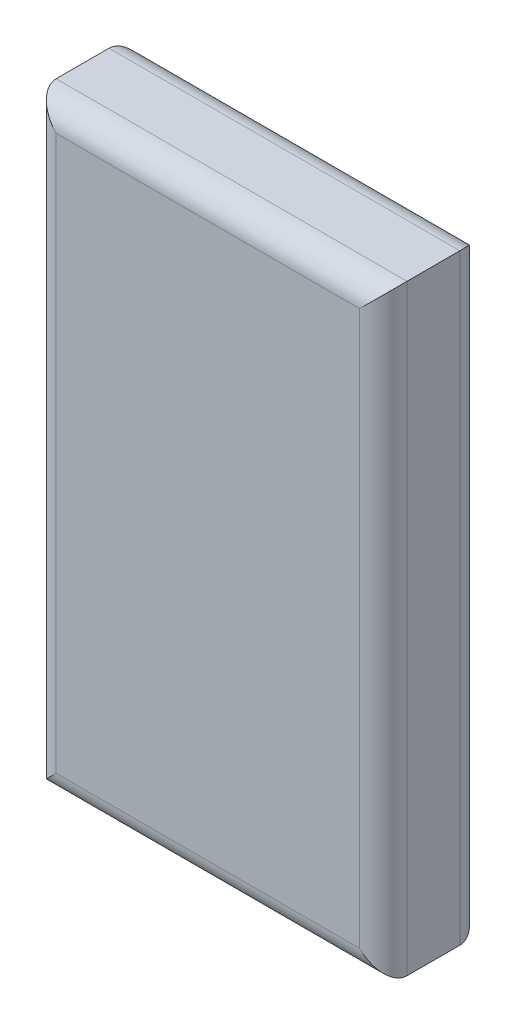
ISO-10303-21;
HEADER;
FILE_DESCRIPTION(('STEP AP214'),'2;1');
FILE_NAME('part.step','',(''),(''),'','','');
FILE_SCHEMA(('AUTOMOTIVE_DESIGN { 1 0 10303 214 1 1 1 1 }'));
ENDSEC;
DATA;
#1=APPLICATION_CONTEXT('core data for automotive mechanical design processes');
#2=APPLICATION_PROTOCOL_DEFINITION('international standard','automotive_design',2000,#1);
#3=PRODUCT_CONTEXT('',#1,'mechanical');
#4=PRODUCT('Part','Part','',(#3));
#5=PRODUCT_RELATED_PRODUCT_CATEGORY('part','',(#4));
#6=PRODUCT_DEFINITION_FORMATION('','',#4);
#7=PRODUCT_DEFINITION_CONTEXT('part definition',#1,'design');
#8=PRODUCT_DEFINITION('design','',#6,#7);
#9=PRODUCT_DEFINITION_SHAPE('','',#8);
#10=(LENGTH_UNIT() NAMED_UNIT(*) SI_UNIT(.MILLI.,.METRE.));
#11=(NAMED_UNIT(*) PLANE_ANGLE_UNIT() SI_UNIT($,.RADIAN.));
#12=(NAMED_UNIT(*) SI_UNIT($,.STERADIAN.) SOLID_ANGLE_UNIT());
#13=UNCERTAINTY_MEASURE_WITH_UNIT(LENGTH_MEASURE(1.E-05),#10,'distance_accuracy_value','');
#14=(GEOMETRIC_REPRESENTATION_CONTEXT(3) GLOBAL_UNCERTAINTY_ASSIGNED_CONTEXT((#13)) GLOBAL_UNIT_ASSIGNED_CONTEXT((#10,
#11,#12)) REPRESENTATION_CONTEXT('',''));
#15=CARTESIAN_POINT('',(0.,0.,0.));
#16=DIRECTION('',(0.,0.,1.));
#17=DIRECTION('',(1.,0.,0.));
#18=AXIS2_PLACEMENT_3D('',#15,#16,#17);
#19=CARTESIAN_POINT('',(11.1125,-19.05,6.35));
#20=DIRECTION('',(-1.,0.,0.));
#21=DIRECTION('',(0.,0.,1.));
#22=AXIS2_PLACEMENT_3D('',#19,#20,#21);
#23=PLANE('',#22);
#24=DIRECTION('',(0.,0.,-1.));
#25=VECTOR('',#24,1.);
#26=CARTESIAN_POINT('',(11.1125,-19.05,6.35));
#27=LINE('',#26,#25);
#28=CARTESIAN_POINT('',(11.1125,-19.05,4.85));
#29=VERTEX_POINT('',#28);
#30=CARTESIAN_POINT('',(11.1125,-19.05,1.5));
#31=VERTEX_POINT('',#30);
#32=EDGE_CURVE('E142',#29,#31,#27,.T.);
#33=ORIENTED_EDGE('',*,*,#32,.T.);
#34=DIRECTION('',(0.,1.,0.));
#35=VECTOR('',#34,1.);
#36=CARTESIAN_POINT('',(11.1125,19.05,1.5));
#37=LINE('',#36,#35);
#38=CARTESIAN_POINT('',(11.1125,19.05,1.5));
#39=VERTEX_POINT('',#38);
#40=EDGE_CURVE('E151',#31,#39,#37,.T.);
#41=ORIENTED_EDGE('',*,*,#40,.T.);
#42=DIRECTION('',(0.,0.,-1.));
#43=VECTOR('',#42,1.);
#44=CARTESIAN_POINT('',(11.1125,19.05,6.35));
#45=LINE('',#44,#43);
#46=CARTESIAN_POINT('',(11.1125,19.05,4.85));
#47=VERTEX_POINT('',#46);
#48=EDGE_CURVE('E120',#47,#39,#45,.T.);
#49=ORIENTED_EDGE('',*,*,#48,.F.);
#50=DIRECTION('',(0.,1.,0.));
#51=VECTOR('',#50,1.);
#52=CARTESIAN_POINT('',(11.1125,-19.05,4.85));
#53=LINE('',#52,#51);
#54=EDGE_CURVE('E153',#47,#29,#53,.F.);
#55=ORIENTED_EDGE('',*,*,#54,.T.);
#56=EDGE_LOOP('',(#33,#41,#49,#55));
#57=FACE_BOUND('',#56,.T.);
#58=ADVANCED_FACE('F33',(#57),#23,.F.);
#59=CARTESIAN_POINT('',(-11.1125,19.05,6.35));
#60=DIRECTION('',(0.,-1.,0.));
#61=DIRECTION('',(0.,0.,-1.));
#62=AXIS2_PLACEMENT_3D('',#59,#60,#61);
#63=PLANE('',#62);
#64=ORIENTED_EDGE('',*,*,#48,.T.);
#65=DIRECTION('',(-1.,0.,0.));
#66=VECTOR('',#65,1.);
#67=CARTESIAN_POINT('',(-11.1125,19.05,1.5));
#68=LINE('',#67,#66);
#69=CARTESIAN_POINT('',(-11.1125,19.05,1.5));
#70=VERTEX_POINT('',#69);
#71=EDGE_CURVE('E119',#39,#70,#68,.T.);
#72=ORIENTED_EDGE('',*,*,#71,.T.);
#73=DIRECTION('',(0.,0.,-1.));
#74=VECTOR('',#73,1.);
#75=CARTESIAN_POINT('',(-11.1125,19.05,6.35));
#76=LINE('',#75,#74);
#77=CARTESIAN_POINT('',(-11.1125,19.05,4.85));
#78=VERTEX_POINT('',#77);
#79=EDGE_CURVE('E102',#78,#70,#76,.T.);
#80=ORIENTED_EDGE('',*,*,#79,.F.);
#81=DIRECTION('',(-1.,0.,0.));
#82=VECTOR('',#81,1.);
#83=CARTESIAN_POINT('',(-11.1125,19.05,4.85));
#84=LINE('',#83,#82);
#85=EDGE_CURVE('E116',#78,#47,#84,.F.);
#86=ORIENTED_EDGE('',*,*,#85,.T.);
#87=EDGE_LOOP('',(#64,#72,#80,#86));
#88=FACE_BOUND('',#87,.T.);
#89=ADVANCED_FACE('F115',(#88),#63,.F.);
#90=CARTESIAN_POINT('',(-11.1125,-19.05,6.35));
#91=DIRECTION('',(1.,0.,0.));
#92=DIRECTION('',(0.,0.,-1.));
#93=AXIS2_PLACEMENT_3D('',#90,#91,#92);
#94=PLANE('',#93);
#95=ORIENTED_EDGE('',*,*,#79,.T.);
#96=DIRECTION('',(0.,-1.,0.));
#97=VECTOR('',#96,1.);
#98=CARTESIAN_POINT('',(-11.1125,-19.05,1.5));
#99=LINE('',#98,#97);
#100=CARTESIAN_POINT('',(-11.1125,-19.05,1.5));
#101=VERTEX_POINT('',#100);
#102=EDGE_CURVE('E108',#70,#101,#99,.T.);
#103=ORIENTED_EDGE('',*,*,#102,.T.);
#104=DIRECTION('',(0.,0.,-1.));
#105=VECTOR('',#104,1.);
#106=CARTESIAN_POINT('',(-11.1125,-19.05,6.35));
#107=LINE('',#106,#105);
#108=CARTESIAN_POINT('',(-11.1125,-19.05,4.85));
#109=VERTEX_POINT('',#108);
#110=EDGE_CURVE('E104',#109,#101,#107,.T.);
#111=ORIENTED_EDGE('',*,*,#110,.F.);
#112=DIRECTION('',(0.,-1.,0.));
#113=VECTOR('',#112,1.);
#114=CARTESIAN_POINT('',(-11.1125,-19.05,4.85));
#115=LINE('',#114,#113);
#116=EDGE_CURVE('E99',#109,#78,#115,.F.);
#117=ORIENTED_EDGE('',*,*,#116,.T.);
#118=EDGE_LOOP('',(#95,#103,#111,#117));
#119=FACE_BOUND('',#118,.T.);
#120=ADVANCED_FACE('F101',(#119),#94,.F.);
#121=CARTESIAN_POINT('',(-11.1125,-19.05,6.35));
#122=DIRECTION('',(0.,1.,0.));
#123=DIRECTION('',(0.,0.,1.));
#124=AXIS2_PLACEMENT_3D('',#121,#122,#123);
#125=PLANE('',#124);
#126=ORIENTED_EDGE('',*,*,#110,.T.);
#127=DIRECTION('',(1.,0.,0.));
#128=VECTOR('',#127,1.);
#129=CARTESIAN_POINT('',(11.1125,-19.05,1.5));
#130=LINE('',#129,#128);
#131=EDGE_CURVE('E155',#101,#31,#130,.T.);
#132=ORIENTED_EDGE('',*,*,#131,.T.);
#133=ORIENTED_EDGE('',*,*,#32,.F.);
#134=DIRECTION('',(1.,0.,0.));
#135=VECTOR('',#134,1.);
#136=CARTESIAN_POINT('',(-11.1125,-19.05,4.85));
#137=LINE('',#136,#135);
#138=EDGE_CURVE('E157',#29,#109,#137,.F.);
#139=ORIENTED_EDGE('',*,*,#138,.T.);
#140=EDGE_LOOP('',(#126,#132,#133,#139));
#141=FACE_BOUND('',#140,.T.);
#142=ADVANCED_FACE('F195',(#141),#125,.F.);
#143=CARTESIAN_POINT('',(0.,0.,6.35));
#144=DIRECTION('',(0.,0.,-1.));
#145=DIRECTION('',(-1.,0.,0.));
#146=AXIS2_PLACEMENT_3D('',#143,#144,#145);
#147=PLANE('',#146);
#148=DIRECTION('',(0.,-1.,0.));
#149=VECTOR('',#148,1.);
#150=CARTESIAN_POINT('',(-9.6125,0.,6.35));
#151=LINE('',#150,#149);
#152=CARTESIAN_POINT('',(-9.6125,17.55,6.35));
#153=VERTEX_POINT('',#152);
#154=CARTESIAN_POINT('',(-9.6125,-17.55,6.35));
#155=VERTEX_POINT('',#154);
#156=EDGE_CURVE('E42',#153,#155,#151,.T.);
#157=ORIENTED_EDGE('',*,*,#156,.T.);
#158=DIRECTION('',(1.,0.,0.));
#159=VECTOR('',#158,1.);
#160=CARTESIAN_POINT('',(0.,-17.55,6.35));
#161=LINE('',#160,#159);
#162=CARTESIAN_POINT('',(9.6125,-17.55,6.35));
#163=VERTEX_POINT('',#162);
#164=EDGE_CURVE('E11',#155,#163,#161,.T.);
#165=ORIENTED_EDGE('',*,*,#164,.T.);
#166=DIRECTION('',(0.,1.,0.));
#167=VECTOR('',#166,1.);
#168=CARTESIAN_POINT('',(9.6125,0.,6.35));
#169=LINE('',#168,#167);
#170=CARTESIAN_POINT('',(9.6125,17.55,6.35));
#171=VERTEX_POINT('',#170);
#172=EDGE_CURVE('E149',#163,#171,#169,.T.);
#173=ORIENTED_EDGE('',*,*,#172,.T.);
#174=DIRECTION('',(-1.,0.,0.));
#175=VECTOR('',#174,1.);
#176=CARTESIAN_POINT('',(0.,17.55,6.35));
#177=LINE('',#176,#175);
#178=EDGE_CURVE('E53',#171,#153,#177,.T.);
#179=ORIENTED_EDGE('',*,*,#178,.T.);
#180=EDGE_LOOP('',(#157,#165,#173,#179));
#181=FACE_BOUND('',#180,.T.);
#182=ADVANCED_FACE('F201',(#181),#147,.F.);
#183=CARTESIAN_POINT('',(0.,0.,0.));
#184=DIRECTION('',(0.,0.,-1.));
#185=DIRECTION('',(-1.,0.,0.));
#186=AXIS2_PLACEMENT_3D('',#183,#184,#185);
#187=PLANE('',#186);
#188=DIRECTION('',(0.,-1.,0.));
#189=VECTOR('',#188,1.);
#190=CARTESIAN_POINT('',(-9.6125,19.05,0.));
#191=LINE('',#190,#189);
#192=CARTESIAN_POINT('',(-9.6125,-17.55,0.));
#193=VERTEX_POINT('',#192);
#194=CARTESIAN_POINT('',(-9.6125,17.55,0.));
#195=VERTEX_POINT('',#194);
#196=EDGE_CURVE('E162',#193,#195,#191,.F.);
#197=ORIENTED_EDGE('',*,*,#196,.T.);
#198=DIRECTION('',(-1.,0.,0.));
#199=VECTOR('',#198,1.);
#200=CARTESIAN_POINT('',(11.1125,17.55,0.));
#201=LINE('',#200,#199);
#202=CARTESIAN_POINT('',(9.6125,17.55,0.));
#203=VERTEX_POINT('',#202);
#204=EDGE_CURVE('E109',#195,#203,#201,.F.);
#205=ORIENTED_EDGE('',*,*,#204,.T.);
#206=DIRECTION('',(0.,1.,0.));
#207=VECTOR('',#206,1.);
#208=CARTESIAN_POINT('',(9.6125,-19.05,0.));
#209=LINE('',#208,#207);
#210=CARTESIAN_POINT('',(9.6125,-17.55,0.));
#211=VERTEX_POINT('',#210);
#212=EDGE_CURVE('E166',#203,#211,#209,.F.);
#213=ORIENTED_EDGE('',*,*,#212,.T.);
#214=DIRECTION('',(1.,0.,0.));
#215=VECTOR('',#214,1.);
#216=CARTESIAN_POINT('',(-11.1125,-17.55,0.));
#217=LINE('',#216,#215);
#218=EDGE_CURVE('E164',#211,#193,#217,.F.);
#219=ORIENTED_EDGE('',*,*,#218,.T.);
#220=EDGE_LOOP('',(#197,#205,#213,#219));
#221=FACE_BOUND('',#220,.T.);
#222=ADVANCED_FACE('F203',(#221),#187,.T.);
#223=CARTESIAN_POINT('',(-11.1125,-17.55,1.5));
#224=DIRECTION('',(-1.,0.,0.));
#225=DIRECTION('',(0.,0.,1.));
#226=AXIS2_PLACEMENT_3D('',#223,#224,#225);
#227=CYLINDRICAL_SURFACE('',#226,1.5);
#228=CARTESIAN_POINT('',(-9.6125,-17.55,1.5));
#229=DIRECTION('',(-0.707106781186547,0.707106781186547,0.));
#230=DIRECTION('',(-0.707106781186547,-0.707106781186547,0.));
#231=AXIS2_PLACEMENT_3D('',#228,#229,#230);
#232=ELLIPSE('',#231,2.12132034355964,1.5);
#233=EDGE_CURVE('E143',#193,#101,#232,.T.);
#234=ORIENTED_EDGE('',*,*,#233,.F.);
#235=ORIENTED_EDGE('',*,*,#218,.F.);
#236=CARTESIAN_POINT('',(9.6125,-17.55,1.5));
#237=DIRECTION('',(-0.707106781186547,-0.707106781186547,0.));
#238=DIRECTION('',(0.707106781186547,-0.707106781186547,0.));
#239=AXIS2_PLACEMENT_3D('',#236,#237,#238);
#240=ELLIPSE('',#239,2.12132034355964,1.5);
#241=EDGE_CURVE('E139',#31,#211,#240,.F.);
#242=ORIENTED_EDGE('',*,*,#241,.F.);
#243=ORIENTED_EDGE('',*,*,#131,.F.);
#244=EDGE_LOOP('',(#234,#235,#242,#243));
#245=FACE_BOUND('',#244,.T.);
#246=ADVANCED_FACE('F182',(#245),#227,.T.);
#247=CARTESIAN_POINT('',(9.6125,-19.05,1.5));
#248=DIRECTION('',(0.,-1.,0.));
#249=DIRECTION('',(0.,0.,-1.));
#250=AXIS2_PLACEMENT_3D('',#247,#248,#249);
#251=CYLINDRICAL_SURFACE('',#250,1.5);
#252=ORIENTED_EDGE('',*,*,#241,.T.);
#253=ORIENTED_EDGE('',*,*,#212,.F.);
#254=CARTESIAN_POINT('',(9.6125,17.55,1.5));
#255=DIRECTION('',(0.707106781186547,-0.707106781186547,0.));
#256=DIRECTION('',(-0.707106781186547,-0.707106781186547,0.));
#257=AXIS2_PLACEMENT_3D('',#254,#255,#256);
#258=ELLIPSE('',#257,2.12132034355964,1.5);
#259=EDGE_CURVE('E130',#39,#203,#258,.F.);
#260=ORIENTED_EDGE('',*,*,#259,.F.);
#261=ORIENTED_EDGE('',*,*,#40,.F.);
#262=EDGE_LOOP('',(#252,#253,#260,#261));
#263=FACE_BOUND('',#262,.T.);
#264=ADVANCED_FACE('F186',(#263),#251,.T.);
#265=CARTESIAN_POINT('',(-9.6125,-19.05,1.5));
#266=DIRECTION('',(0.,1.,0.));
#267=DIRECTION('',(0.,0.,1.));
#268=AXIS2_PLACEMENT_3D('',#265,#266,#267);
#269=CYLINDRICAL_SURFACE('',#268,1.5);
#270=ORIENTED_EDGE('',*,*,#233,.T.);
#271=ORIENTED_EDGE('',*,*,#102,.F.);
#272=CARTESIAN_POINT('',(-9.6125,17.55,1.5));
#273=DIRECTION('',(0.707106781186547,0.707106781186547,0.));
#274=DIRECTION('',(-0.707106781186547,0.707106781186547,0.));
#275=AXIS2_PLACEMENT_3D('',#272,#273,#274);
#276=ELLIPSE('',#275,2.12132034355964,1.5);
#277=EDGE_CURVE('E129',#195,#70,#276,.T.);
#278=ORIENTED_EDGE('',*,*,#277,.F.);
#279=ORIENTED_EDGE('',*,*,#196,.F.);
#280=EDGE_LOOP('',(#270,#271,#278,#279));
#281=FACE_BOUND('',#280,.T.);
#282=ADVANCED_FACE('F194',(#281),#269,.T.);
#283=CARTESIAN_POINT('',(-11.1125,17.55,1.5));
#284=DIRECTION('',(1.,0.,0.));
#285=DIRECTION('',(0.,0.,-1.));
#286=AXIS2_PLACEMENT_3D('',#283,#284,#285);
#287=CYLINDRICAL_SURFACE('',#286,1.5);
#288=ORIENTED_EDGE('',*,*,#259,.T.);
#289=ORIENTED_EDGE('',*,*,#204,.F.);
#290=ORIENTED_EDGE('',*,*,#277,.T.);
#291=ORIENTED_EDGE('',*,*,#71,.F.);
#292=EDGE_LOOP('',(#288,#289,#290,#291));
#293=FACE_BOUND('',#292,.T.);
#294=ADVANCED_FACE('F189',(#293),#287,.T.);
#295=CARTESIAN_POINT('',(0.,17.55,4.85));
#296=DIRECTION('',(-1.,0.,0.));
#297=DIRECTION('',(0.,0.,1.));
#298=AXIS2_PLACEMENT_3D('',#295,#296,#297);
#299=CYLINDRICAL_SURFACE('',#298,1.5);
#300=CARTESIAN_POINT('',(9.6125,17.55,4.85));
#301=DIRECTION('',(-0.707106781186547,0.707106781186547,0.));
#302=DIRECTION('',(0.707106781186547,0.707106781186547,0.));
#303=AXIS2_PLACEMENT_3D('',#300,#301,#302);
#304=ELLIPSE('',#303,2.12132034355964,1.5);
#305=EDGE_CURVE('E125',#47,#171,#304,.F.);
#306=ORIENTED_EDGE('',*,*,#305,.F.);
#307=ORIENTED_EDGE('',*,*,#85,.F.);
#308=CARTESIAN_POINT('',(-9.6125,17.55,4.85));
#309=DIRECTION('',(-0.707106781186547,-0.707106781186547,0.));
#310=DIRECTION('',(-0.707106781186547,0.707106781186547,0.));
#311=AXIS2_PLACEMENT_3D('',#308,#309,#310);
#312=ELLIPSE('',#311,2.12132034355964,1.5);
#313=EDGE_CURVE('E37',#153,#78,#312,.T.);
#314=ORIENTED_EDGE('',*,*,#313,.F.);
#315=ORIENTED_EDGE('',*,*,#178,.F.);
#316=EDGE_LOOP('',(#306,#307,#314,#315));
#317=FACE_BOUND('',#316,.T.);
#318=ADVANCED_FACE('F35',(#317),#299,.T.);
#319=CARTESIAN_POINT('',(-9.6125,0.,4.85));
#320=DIRECTION('',(0.,-1.,0.));
#321=DIRECTION('',(0.,0.,-1.));
#322=AXIS2_PLACEMENT_3D('',#319,#320,#321);
#323=CYLINDRICAL_SURFACE('',#322,1.5);
#324=ORIENTED_EDGE('',*,*,#313,.T.);
#325=ORIENTED_EDGE('',*,*,#116,.F.);
#326=CARTESIAN_POINT('',(-9.6125,-17.55,4.85));
#327=DIRECTION('',(0.707106781186547,-0.707106781186547,0.));
#328=DIRECTION('',(-0.707106781186547,-0.707106781186547,0.));
#329=AXIS2_PLACEMENT_3D('',#326,#327,#328);
#330=ELLIPSE('',#329,2.12132034355964,1.5);
#331=EDGE_CURVE('E132',#155,#109,#330,.T.);
#332=ORIENTED_EDGE('',*,*,#331,.F.);
#333=ORIENTED_EDGE('',*,*,#156,.F.);
#334=EDGE_LOOP('',(#324,#325,#332,#333));
#335=FACE_BOUND('',#334,.T.);
#336=ADVANCED_FACE('F128',(#335),#323,.T.);
#337=CARTESIAN_POINT('',(9.6125,0.,4.85));
#338=DIRECTION('',(0.,1.,0.));
#339=DIRECTION('',(0.,0.,1.));
#340=AXIS2_PLACEMENT_3D('',#337,#338,#339);
#341=CYLINDRICAL_SURFACE('',#340,1.5);
#342=ORIENTED_EDGE('',*,*,#305,.T.);
#343=ORIENTED_EDGE('',*,*,#172,.F.);
#344=CARTESIAN_POINT('',(9.6125,-17.55,4.85));
#345=DIRECTION('',(0.707106781186547,0.707106781186547,0.));
#346=DIRECTION('',(-0.707106781186547,0.707106781186547,0.));
#347=AXIS2_PLACEMENT_3D('',#344,#345,#346);
#348=ELLIPSE('',#347,2.12132034355964,1.5);
#349=EDGE_CURVE('E135',#29,#163,#348,.F.);
#350=ORIENTED_EDGE('',*,*,#349,.F.);
#351=ORIENTED_EDGE('',*,*,#54,.F.);
#352=EDGE_LOOP('',(#342,#343,#350,#351));
#353=FACE_BOUND('',#352,.T.);
#354=ADVANCED_FACE('F200',(#353),#341,.T.);
#355=CARTESIAN_POINT('',(0.,-17.55,4.85));
#356=DIRECTION('',(1.,0.,0.));
#357=DIRECTION('',(0.,0.,-1.));
#358=AXIS2_PLACEMENT_3D('',#355,#356,#357);
#359=CYLINDRICAL_SURFACE('',#358,1.5);
#360=ORIENTED_EDGE('',*,*,#331,.T.);
#361=ORIENTED_EDGE('',*,*,#138,.F.);
#362=ORIENTED_EDGE('',*,*,#349,.T.);
#363=ORIENTED_EDGE('',*,*,#164,.F.);
#364=EDGE_LOOP('',(#360,#361,#362,#363));
#365=FACE_BOUND('',#364,.T.);
#366=ADVANCED_FACE('F198',(#365),#359,.T.);
#367=CLOSED_SHELL('',(#58,#89,#120,#142,#182,#222,#246,#264,#282,#294,#318,#336,#354,#366));
#368=MANIFOLD_SOLID_BREP('B2',#367);
#369=ADVANCED_BREP_SHAPE_REPRESENTATION('',(#18,#368),#14);
#370=SHAPE_DEFINITION_REPRESENTATION(#9,#369);
ENDSEC;
END-ISO-10303-21;
